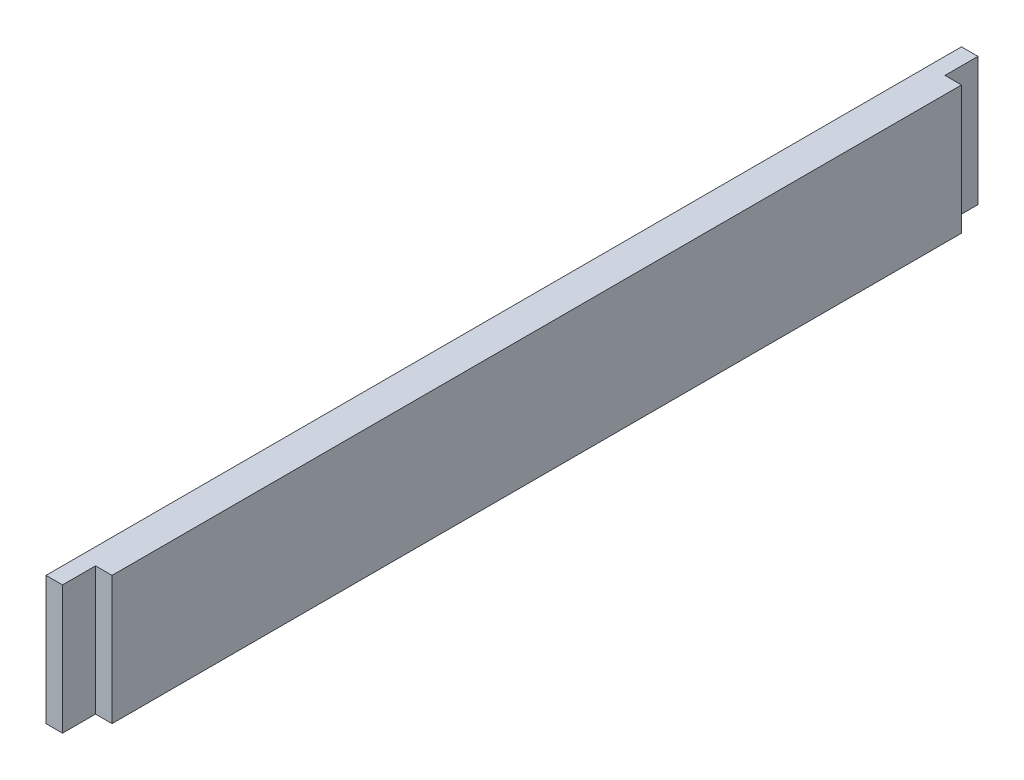
ISO-10303-21;
HEADER;
FILE_DESCRIPTION(('STEP AP214'),'2;1');
FILE_NAME('part.step','',(''),(''),'','','');
FILE_SCHEMA(('AUTOMOTIVE_DESIGN { 1 0 10303 214 1 1 1 1 }'));
ENDSEC;
DATA;
#1=APPLICATION_CONTEXT('core data for automotive mechanical design processes');
#2=APPLICATION_PROTOCOL_DEFINITION('international standard','automotive_design',2000,#1);
#3=PRODUCT_CONTEXT('',#1,'mechanical');
#4=PRODUCT('Part','Part','',(#3));
#5=PRODUCT_RELATED_PRODUCT_CATEGORY('part','',(#4));
#6=PRODUCT_DEFINITION_FORMATION('','',#4);
#7=PRODUCT_DEFINITION_CONTEXT('part definition',#1,'design');
#8=PRODUCT_DEFINITION('design','',#6,#7);
#9=PRODUCT_DEFINITION_SHAPE('','',#8);
#10=(LENGTH_UNIT() NAMED_UNIT(*) SI_UNIT(.MILLI.,.METRE.));
#11=(NAMED_UNIT(*) PLANE_ANGLE_UNIT() SI_UNIT($,.RADIAN.));
#12=(NAMED_UNIT(*) SI_UNIT($,.STERADIAN.) SOLID_ANGLE_UNIT());
#13=UNCERTAINTY_MEASURE_WITH_UNIT(LENGTH_MEASURE(1.E-05),#10,'distance_accuracy_value','');
#14=(GEOMETRIC_REPRESENTATION_CONTEXT(3) GLOBAL_UNCERTAINTY_ASSIGNED_CONTEXT((#13)) GLOBAL_UNIT_ASSIGNED_CONTEXT((#10,
#11,#12)) REPRESENTATION_CONTEXT('',''));
#15=CARTESIAN_POINT('',(0.,0.,0.));
#16=DIRECTION('',(0.,0.,1.));
#17=DIRECTION('',(1.,0.,0.));
#18=AXIS2_PLACEMENT_3D('',#15,#16,#17);
#19=CARTESIAN_POINT('',(18.,0.,0.));
#20=DIRECTION('',(0.,0.,-1.));
#21=DIRECTION('',(-1.,0.,0.));
#22=AXIS2_PLACEMENT_3D('',#19,#20,#21);
#23=PLANE('',#22);
#24=DIRECTION('',(0.,-1.,0.));
#25=VECTOR('',#24,1.);
#26=CARTESIAN_POINT('',(9.,70.,0.));
#27=LINE('',#26,#25);
#28=CARTESIAN_POINT('',(9.,70.,0.));
#29=VERTEX_POINT('',#28);
#30=CARTESIAN_POINT('',(9.,0.,0.));
#31=VERTEX_POINT('',#30);
#32=EDGE_CURVE('E96',#29,#31,#27,.T.);
#33=ORIENTED_EDGE('',*,*,#32,.F.);
#34=DIRECTION('',(-1.,0.,0.));
#35=VECTOR('',#34,1.);
#36=CARTESIAN_POINT('',(18.,70.,0.));
#37=LINE('',#36,#35);
#38=CARTESIAN_POINT('',(0.,70.,0.));
#39=VERTEX_POINT('',#38);
#40=EDGE_CURVE('E118',#29,#39,#37,.T.);
#41=ORIENTED_EDGE('',*,*,#40,.T.);
#42=DIRECTION('',(0.,-1.,0.));
#43=VECTOR('',#42,1.);
#44=CARTESIAN_POINT('',(0.,0.,0.));
#45=LINE('',#44,#43);
#46=CARTESIAN_POINT('',(0.,0.,0.));
#47=VERTEX_POINT('',#46);
#48=EDGE_CURVE('E117',#39,#47,#45,.T.);
#49=ORIENTED_EDGE('',*,*,#48,.T.);
#50=DIRECTION('',(-1.,0.,0.));
#51=VECTOR('',#50,1.);
#52=CARTESIAN_POINT('',(18.,0.,0.));
#53=LINE('',#52,#51);
#54=EDGE_CURVE('E11',#31,#47,#53,.T.);
#55=ORIENTED_EDGE('',*,*,#54,.F.);
#56=EDGE_LOOP('',(#33,#41,#49,#55));
#57=FACE_BOUND('',#56,.T.);
#58=ADVANCED_FACE('F33',(#57),#23,.F.);
#59=CARTESIAN_POINT('',(18.,0.,0.));
#60=DIRECTION('',(0.,1.,0.));
#61=DIRECTION('',(0.,0.,1.));
#62=AXIS2_PLACEMENT_3D('',#59,#60,#61);
#63=PLANE('',#62);
#64=DIRECTION('',(0.,0.,-1.));
#65=VECTOR('',#64,1.);
#66=CARTESIAN_POINT('',(18.,0.,0.));
#67=LINE('',#66,#65);
#68=CARTESIAN_POINT('',(18.,0.,-18.));
#69=VERTEX_POINT('',#68);
#70=CARTESIAN_POINT('',(18.,0.,-481.));
#71=VERTEX_POINT('',#70);
#72=EDGE_CURVE('E137',#69,#71,#67,.T.);
#73=ORIENTED_EDGE('',*,*,#72,.F.);
#74=DIRECTION('',(1.,0.,0.));
#75=VECTOR('',#74,1.);
#76=CARTESIAN_POINT('',(9.,0.,-18.));
#77=LINE('',#76,#75);
#78=CARTESIAN_POINT('',(9.,0.,-18.));
#79=VERTEX_POINT('',#78);
#80=EDGE_CURVE('E55',#79,#69,#77,.T.);
#81=ORIENTED_EDGE('',*,*,#80,.F.);
#82=DIRECTION('',(0.,0.,-1.));
#83=VECTOR('',#82,1.);
#84=CARTESIAN_POINT('',(9.,0.,0.));
#85=LINE('',#84,#83);
#86=EDGE_CURVE('E100',#31,#79,#85,.T.);
#87=ORIENTED_EDGE('',*,*,#86,.F.);
#88=ORIENTED_EDGE('',*,*,#54,.T.);
#89=DIRECTION('',(0.,0.,-1.));
#90=VECTOR('',#89,1.);
#91=CARTESIAN_POINT('',(0.,0.,0.));
#92=LINE('',#91,#90);
#93=CARTESIAN_POINT('',(0.,0.,-499.));
#94=VERTEX_POINT('',#93);
#95=EDGE_CURVE('E122',#47,#94,#92,.T.);
#96=ORIENTED_EDGE('',*,*,#95,.T.);
#97=DIRECTION('',(-1.,0.,0.));
#98=VECTOR('',#97,1.);
#99=CARTESIAN_POINT('',(18.,0.,-499.));
#100=LINE('',#99,#98);
#101=CARTESIAN_POINT('',(9.,0.,-499.));
#102=VERTEX_POINT('',#101);
#103=EDGE_CURVE('E40',#102,#94,#100,.T.);
#104=ORIENTED_EDGE('',*,*,#103,.F.);
#105=DIRECTION('',(0.,0.,-1.));
#106=VECTOR('',#105,1.);
#107=CARTESIAN_POINT('',(9.,0.,-499.));
#108=LINE('',#107,#106);
#109=CARTESIAN_POINT('',(9.,0.,-481.));
#110=VERTEX_POINT('',#109);
#111=EDGE_CURVE('E159',#110,#102,#108,.T.);
#112=ORIENTED_EDGE('',*,*,#111,.F.);
#113=DIRECTION('',(1.,0.,0.));
#114=VECTOR('',#113,1.);
#115=CARTESIAN_POINT('',(9.,0.,-481.));
#116=LINE('',#115,#114);
#117=EDGE_CURVE('E167',#110,#71,#116,.T.);
#118=ORIENTED_EDGE('',*,*,#117,.T.);
#119=EDGE_LOOP('',(#73,#81,#87,#88,#96,#104,#112,#118));
#120=FACE_BOUND('',#119,.T.);
#121=ADVANCED_FACE('F110',(#120),#63,.F.);
#122=CARTESIAN_POINT('',(18.,0.,-499.));
#123=DIRECTION('',(0.,0.,1.));
#124=DIRECTION('',(1.,0.,0.));
#125=AXIS2_PLACEMENT_3D('',#122,#123,#124);
#126=PLANE('',#125);
#127=DIRECTION('',(-1.,0.,0.));
#128=VECTOR('',#127,1.);
#129=CARTESIAN_POINT('',(18.,70.,-499.));
#130=LINE('',#129,#128);
#131=CARTESIAN_POINT('',(9.,70.,-499.));
#132=VERTEX_POINT('',#131);
#133=CARTESIAN_POINT('',(0.,70.,-499.));
#134=VERTEX_POINT('',#133);
#135=EDGE_CURVE('E139',#132,#134,#130,.T.);
#136=ORIENTED_EDGE('',*,*,#135,.F.);
#137=DIRECTION('',(0.,1.,0.));
#138=VECTOR('',#137,1.);
#139=CARTESIAN_POINT('',(9.,70.,-499.));
#140=LINE('',#139,#138);
#141=EDGE_CURVE('E146',#102,#132,#140,.T.);
#142=ORIENTED_EDGE('',*,*,#141,.F.);
#143=ORIENTED_EDGE('',*,*,#103,.T.);
#144=DIRECTION('',(0.,1.,0.));
#145=VECTOR('',#144,1.);
#146=CARTESIAN_POINT('',(0.,0.,-499.));
#147=LINE('',#146,#145);
#148=EDGE_CURVE('E125',#94,#134,#147,.T.);
#149=ORIENTED_EDGE('',*,*,#148,.T.);
#150=EDGE_LOOP('',(#136,#142,#143,#149));
#151=FACE_BOUND('',#150,.T.);
#152=ADVANCED_FACE('F144',(#151),#126,.F.);
#153=CARTESIAN_POINT('',(18.,70.,0.));
#154=DIRECTION('',(0.,-1.,0.));
#155=DIRECTION('',(0.,0.,-1.));
#156=AXIS2_PLACEMENT_3D('',#153,#154,#155);
#157=PLANE('',#156);
#158=DIRECTION('',(0.,0.,1.));
#159=VECTOR('',#158,1.);
#160=CARTESIAN_POINT('',(9.,70.,0.));
#161=LINE('',#160,#159);
#162=CARTESIAN_POINT('',(9.,70.,-18.));
#163=VERTEX_POINT('',#162);
#164=EDGE_CURVE('E102',#163,#29,#161,.T.);
#165=ORIENTED_EDGE('',*,*,#164,.F.);
#166=DIRECTION('',(1.,0.,0.));
#167=VECTOR('',#166,1.);
#168=CARTESIAN_POINT('',(9.,70.,-18.));
#169=LINE('',#168,#167);
#170=CARTESIAN_POINT('',(18.,70.,-18.));
#171=VERTEX_POINT('',#170);
#172=EDGE_CURVE('E123',#163,#171,#169,.T.);
#173=ORIENTED_EDGE('',*,*,#172,.T.);
#174=DIRECTION('',(0.,0.,1.));
#175=VECTOR('',#174,1.);
#176=CARTESIAN_POINT('',(18.,70.,0.));
#177=LINE('',#176,#175);
#178=CARTESIAN_POINT('',(18.,70.,-481.));
#179=VERTEX_POINT('',#178);
#180=EDGE_CURVE('E130',#179,#171,#177,.T.);
#181=ORIENTED_EDGE('',*,*,#180,.F.);
#182=DIRECTION('',(1.,0.,0.));
#183=VECTOR('',#182,1.);
#184=CARTESIAN_POINT('',(9.,70.0000000000001,-481.));
#185=LINE('',#184,#183);
#186=CARTESIAN_POINT('',(9.,70.0000000000001,-481.));
#187=VERTEX_POINT('',#186);
#188=EDGE_CURVE('E47',#187,#179,#185,.T.);
#189=ORIENTED_EDGE('',*,*,#188,.F.);
#190=DIRECTION('',(0.,0.,1.));
#191=VECTOR('',#190,1.);
#192=CARTESIAN_POINT('',(9.,70.,-499.));
#193=LINE('',#192,#191);
#194=EDGE_CURVE('E153',#132,#187,#193,.T.);
#195=ORIENTED_EDGE('',*,*,#194,.F.);
#196=ORIENTED_EDGE('',*,*,#135,.T.);
#197=DIRECTION('',(0.,0.,1.));
#198=VECTOR('',#197,1.);
#199=CARTESIAN_POINT('',(0.,70.,0.));
#200=LINE('',#199,#198);
#201=EDGE_CURVE('E135',#134,#39,#200,.T.);
#202=ORIENTED_EDGE('',*,*,#201,.T.);
#203=ORIENTED_EDGE('',*,*,#40,.F.);
#204=EDGE_LOOP('',(#165,#173,#181,#189,#195,#196,#202,#203));
#205=FACE_BOUND('',#204,.T.);
#206=ADVANCED_FACE('F150',(#205),#157,.F.);
#207=CARTESIAN_POINT('',(18.,0.,0.));
#208=DIRECTION('',(-1.,0.,0.));
#209=DIRECTION('',(0.,0.,1.));
#210=AXIS2_PLACEMENT_3D('',#207,#208,#209);
#211=PLANE('',#210);
#212=ORIENTED_EDGE('',*,*,#180,.T.);
#213=DIRECTION('',(0.,1.,0.));
#214=VECTOR('',#213,1.);
#215=CARTESIAN_POINT('',(18.,70.,-18.));
#216=LINE('',#215,#214);
#217=EDGE_CURVE('E106',#69,#171,#216,.T.);
#218=ORIENTED_EDGE('',*,*,#217,.F.);
#219=ORIENTED_EDGE('',*,*,#72,.T.);
#220=DIRECTION('',(0.,-1.,0.));
#221=VECTOR('',#220,1.);
#222=CARTESIAN_POINT('',(18.,70.0000000000001,-481.));
#223=LINE('',#222,#221);
#224=EDGE_CURVE('E161',#179,#71,#223,.T.);
#225=ORIENTED_EDGE('',*,*,#224,.F.);
#226=EDGE_LOOP('',(#212,#218,#219,#225));
#227=FACE_BOUND('',#226,.T.);
#228=ADVANCED_FACE('F173',(#227),#211,.F.);
#229=CARTESIAN_POINT('',(0.,0.,0.));
#230=DIRECTION('',(-1.,0.,0.));
#231=DIRECTION('',(0.,0.,1.));
#232=AXIS2_PLACEMENT_3D('',#229,#230,#231);
#233=PLANE('',#232);
#234=ORIENTED_EDGE('',*,*,#48,.F.);
#235=ORIENTED_EDGE('',*,*,#201,.F.);
#236=ORIENTED_EDGE('',*,*,#148,.F.);
#237=ORIENTED_EDGE('',*,*,#95,.F.);
#238=EDGE_LOOP('',(#234,#235,#236,#237));
#239=FACE_BOUND('',#238,.T.);
#240=ADVANCED_FACE('F148',(#239),#233,.T.);
#241=CARTESIAN_POINT('',(9.,70.0000000000001,-481.));
#242=DIRECTION('',(0.,0.,1.));
#243=DIRECTION('',(0.,-1.,0.));
#244=AXIS2_PLACEMENT_3D('',#241,#242,#243);
#245=PLANE('',#244);
#246=ORIENTED_EDGE('',*,*,#224,.T.);
#247=ORIENTED_EDGE('',*,*,#117,.F.);
#248=DIRECTION('',(0.,-1.,0.));
#249=VECTOR('',#248,1.);
#250=CARTESIAN_POINT('',(9.,70.0000000000001,-481.));
#251=LINE('',#250,#249);
#252=EDGE_CURVE('E157',#187,#110,#251,.T.);
#253=ORIENTED_EDGE('',*,*,#252,.F.);
#254=ORIENTED_EDGE('',*,*,#188,.T.);
#255=EDGE_LOOP('',(#246,#247,#253,#254));
#256=FACE_BOUND('',#255,.T.);
#257=ADVANCED_FACE('F186',(#256),#245,.F.);
#258=CARTESIAN_POINT('',(9.,0.,0.));
#259=DIRECTION('',(-1.,0.,0.));
#260=DIRECTION('',(0.,0.,1.));
#261=AXIS2_PLACEMENT_3D('',#258,#259,#260);
#262=PLANE('',#261);
#263=ORIENTED_EDGE('',*,*,#141,.T.);
#264=ORIENTED_EDGE('',*,*,#194,.T.);
#265=ORIENTED_EDGE('',*,*,#252,.T.);
#266=ORIENTED_EDGE('',*,*,#111,.T.);
#267=EDGE_LOOP('',(#263,#264,#265,#266));
#268=FACE_BOUND('',#267,.T.);
#269=ADVANCED_FACE('F179',(#268),#262,.F.);
#270=CARTESIAN_POINT('',(9.,70.,-18.));
#271=DIRECTION('',(0.,0.,-1.));
#272=DIRECTION('',(0.,1.,0.));
#273=AXIS2_PLACEMENT_3D('',#270,#271,#272);
#274=PLANE('',#273);
#275=ORIENTED_EDGE('',*,*,#217,.T.);
#276=ORIENTED_EDGE('',*,*,#172,.F.);
#277=DIRECTION('',(0.,1.,0.));
#278=VECTOR('',#277,1.);
#279=CARTESIAN_POINT('',(9.,70.,-18.));
#280=LINE('',#279,#278);
#281=EDGE_CURVE('E113',#79,#163,#280,.T.);
#282=ORIENTED_EDGE('',*,*,#281,.F.);
#283=ORIENTED_EDGE('',*,*,#80,.T.);
#284=EDGE_LOOP('',(#275,#276,#282,#283));
#285=FACE_BOUND('',#284,.T.);
#286=ADVANCED_FACE('F174',(#285),#274,.F.);
#287=CARTESIAN_POINT('',(9.,0.,0.));
#288=DIRECTION('',(1.,0.,0.));
#289=DIRECTION('',(0.,0.,-1.));
#290=AXIS2_PLACEMENT_3D('',#287,#288,#289);
#291=PLANE('',#290);
#292=ORIENTED_EDGE('',*,*,#32,.T.);
#293=ORIENTED_EDGE('',*,*,#86,.T.);
#294=ORIENTED_EDGE('',*,*,#281,.T.);
#295=ORIENTED_EDGE('',*,*,#164,.T.);
#296=EDGE_LOOP('',(#292,#293,#294,#295));
#297=FACE_BOUND('',#296,.T.);
#298=ADVANCED_FACE('F98',(#297),#291,.T.);
#299=CLOSED_SHELL('',(#58,#121,#152,#206,#228,#240,#257,#269,#286,#298));
#300=MANIFOLD_SOLID_BREP('B2',#299);
#301=ADVANCED_BREP_SHAPE_REPRESENTATION('',(#18,#300),#14);
#302=SHAPE_DEFINITION_REPRESENTATION(#9,#301);
ENDSEC;
END-ISO-10303-21;
